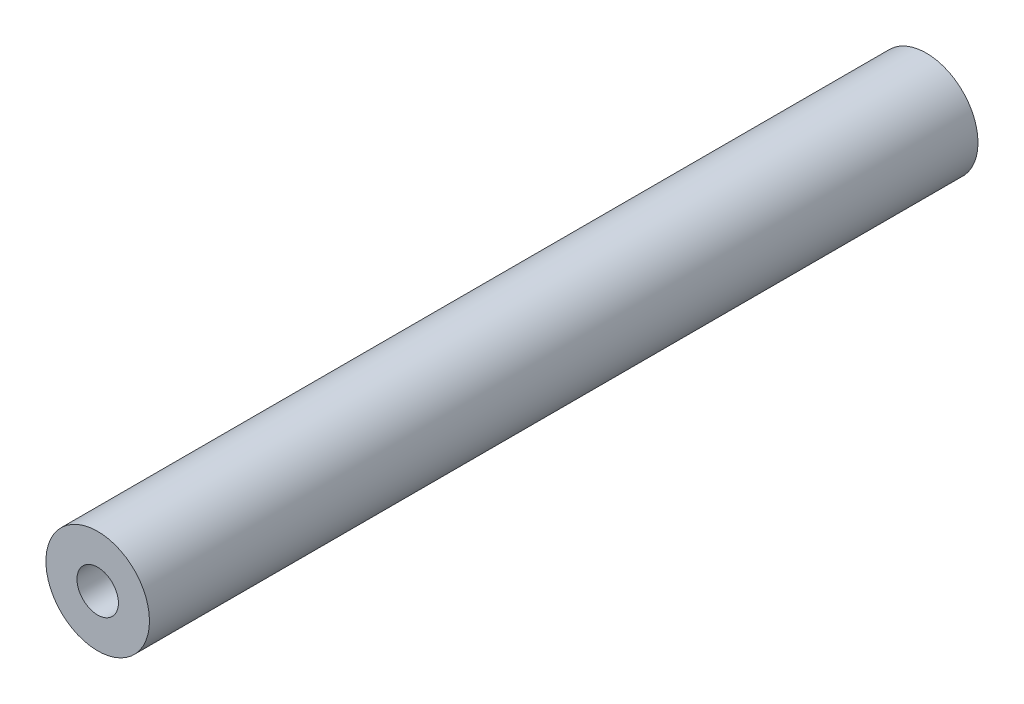
ISO-10303-21;
HEADER;
FILE_DESCRIPTION(('STEP AP214'),'2;1');
FILE_NAME('part.step','',(''),(''),'','','');
FILE_SCHEMA(('AUTOMOTIVE_DESIGN { 1 0 10303 214 1 1 1 1 }'));
ENDSEC;
DATA;
#1=APPLICATION_CONTEXT('core data for automotive mechanical design processes');
#2=APPLICATION_PROTOCOL_DEFINITION('international standard','automotive_design',2000,#1);
#3=PRODUCT_CONTEXT('',#1,'mechanical');
#4=PRODUCT('Part','Part','',(#3));
#5=PRODUCT_RELATED_PRODUCT_CATEGORY('part','',(#4));
#6=PRODUCT_DEFINITION_FORMATION('','',#4);
#7=PRODUCT_DEFINITION_CONTEXT('part definition',#1,'design');
#8=PRODUCT_DEFINITION('design','',#6,#7);
#9=PRODUCT_DEFINITION_SHAPE('','',#8);
#10=(LENGTH_UNIT() NAMED_UNIT(*) SI_UNIT(.MILLI.,.METRE.));
#11=(NAMED_UNIT(*) PLANE_ANGLE_UNIT() SI_UNIT($,.RADIAN.));
#12=(NAMED_UNIT(*) SI_UNIT($,.STERADIAN.) SOLID_ANGLE_UNIT());
#13=UNCERTAINTY_MEASURE_WITH_UNIT(LENGTH_MEASURE(1.E-05),#10,'distance_accuracy_value','');
#14=(GEOMETRIC_REPRESENTATION_CONTEXT(3) GLOBAL_UNCERTAINTY_ASSIGNED_CONTEXT((#13)) GLOBAL_UNIT_ASSIGNED_CONTEXT((#10,
#11,#12)) REPRESENTATION_CONTEXT('',''));
#15=CARTESIAN_POINT('',(0.,0.,0.));
#16=DIRECTION('',(0.,0.,1.));
#17=DIRECTION('',(1.,0.,0.));
#18=AXIS2_PLACEMENT_3D('',#15,#16,#17);
#19=CARTESIAN_POINT('',(0.,0.,32.));
#20=DIRECTION('',(0.,0.,1.));
#21=DIRECTION('',(1.,0.,0.));
#22=AXIS2_PLACEMENT_3D('',#19,#20,#21);
#23=PLANE('',#22);
#24=CARTESIAN_POINT('',(0.,0.,32.));
#25=DIRECTION('',(0.,0.,1.));
#26=DIRECTION('',(1.,0.,0.));
#27=AXIS2_PLACEMENT_3D('',#24,#25,#26);
#28=CIRCLE('',#27,4.);
#29=CARTESIAN_POINT('',(4.,0.,32.));
#30=VERTEX_POINT('',#29);
#31=EDGE_CURVE('E10',#30,#30,#28,.T.);
#32=ORIENTED_EDGE('',*,*,#31,.T.);
#33=EDGE_LOOP('',(#32));
#34=FACE_BOUND('',#33,.T.);
#35=CARTESIAN_POINT('',(0.,0.,32.));
#36=DIRECTION('',(0.,0.,1.));
#37=DIRECTION('',(1.,0.,0.));
#38=AXIS2_PLACEMENT_3D('',#35,#36,#37);
#39=CIRCLE('',#38,1.6);
#40=CARTESIAN_POINT('',(1.6,0.,32.));
#41=VERTEX_POINT('',#40);
#42=EDGE_CURVE('E49',#41,#41,#39,.T.);
#43=ORIENTED_EDGE('',*,*,#42,.F.);
#44=EDGE_LOOP('',(#43));
#45=FACE_BOUND('',#44,.T.);
#46=ADVANCED_FACE('F39',(#34,#45),#23,.T.);
#47=CARTESIAN_POINT('',(0.,0.,-32.));
#48=DIRECTION('',(0.,0.,1.));
#49=DIRECTION('',(1.,0.,0.));
#50=AXIS2_PLACEMENT_3D('',#47,#48,#49);
#51=PLANE('',#50);
#52=CARTESIAN_POINT('',(0.,0.,-32.));
#53=DIRECTION('',(0.,0.,1.));
#54=DIRECTION('',(1.,0.,0.));
#55=AXIS2_PLACEMENT_3D('',#52,#53,#54);
#56=CIRCLE('',#55,4.);
#57=CARTESIAN_POINT('',(4.,0.,-32.));
#58=VERTEX_POINT('',#57);
#59=EDGE_CURVE('E43',#58,#58,#56,.T.);
#60=ORIENTED_EDGE('',*,*,#59,.F.);
#61=EDGE_LOOP('',(#60));
#62=FACE_BOUND('',#61,.T.);
#63=CARTESIAN_POINT('',(0.,0.,-32.));
#64=DIRECTION('',(0.,0.,1.));
#65=DIRECTION('',(1.,0.,0.));
#66=AXIS2_PLACEMENT_3D('',#63,#64,#65);
#67=CIRCLE('',#66,1.6);
#68=CARTESIAN_POINT('',(1.6,0.,-32.));
#69=VERTEX_POINT('',#68);
#70=EDGE_CURVE('E55',#69,#69,#67,.T.);
#71=ORIENTED_EDGE('',*,*,#70,.T.);
#72=EDGE_LOOP('',(#71));
#73=FACE_BOUND('',#72,.T.);
#74=ADVANCED_FACE('F64',(#62,#73),#51,.F.);
#75=CARTESIAN_POINT('',(0.,0.,32.));
#76=DIRECTION('',(0.,0.,-1.));
#77=DIRECTION('',(-1.,0.,0.));
#78=AXIS2_PLACEMENT_3D('',#75,#76,#77);
#79=CYLINDRICAL_SURFACE('',#78,4.);
#80=ORIENTED_EDGE('',*,*,#31,.F.);
#81=EDGE_LOOP('',(#80));
#82=FACE_BOUND('',#81,.T.);
#83=ORIENTED_EDGE('',*,*,#59,.T.);
#84=EDGE_LOOP('',(#83));
#85=FACE_BOUND('',#84,.T.);
#86=ADVANCED_FACE('F41',(#82,#85),#79,.T.);
#87=CARTESIAN_POINT('',(0.,0.,32.));
#88=DIRECTION('',(0.,0.,-1.));
#89=DIRECTION('',(-1.,0.,0.));
#90=AXIS2_PLACEMENT_3D('',#87,#88,#89);
#91=CYLINDRICAL_SURFACE('',#90,1.6);
#92=ORIENTED_EDGE('',*,*,#42,.T.);
#93=EDGE_LOOP('',(#92));
#94=FACE_BOUND('',#93,.T.);
#95=ORIENTED_EDGE('',*,*,#70,.F.);
#96=EDGE_LOOP('',(#95));
#97=FACE_BOUND('',#96,.T.);
#98=ADVANCED_FACE('F59',(#94,#97),#91,.F.);
#99=CLOSED_SHELL('',(#46,#74,#86,#98));
#100=MANIFOLD_SOLID_BREP('B2',#99);
#101=ADVANCED_BREP_SHAPE_REPRESENTATION('',(#18,#100),#14);
#102=SHAPE_DEFINITION_REPRESENTATION(#9,#101);
ENDSEC;
END-ISO-10303-21;
